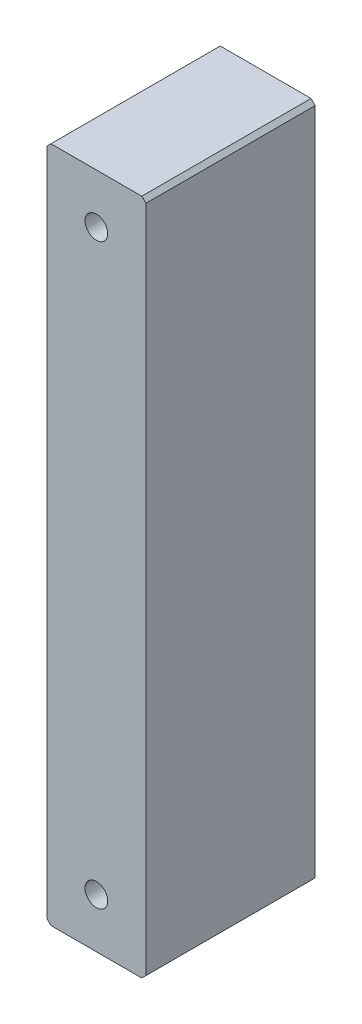
ISO-10303-21;
HEADER;
FILE_DESCRIPTION(('STEP AP214'),'2;1');
FILE_NAME('part.step','',(''),(''),'','','');
FILE_SCHEMA(('AUTOMOTIVE_DESIGN { 1 0 10303 214 1 1 1 1 }'));
ENDSEC;
DATA;
#1=APPLICATION_CONTEXT('core data for automotive mechanical design processes');
#2=APPLICATION_PROTOCOL_DEFINITION('international standard','automotive_design',2000,#1);
#3=PRODUCT_CONTEXT('',#1,'mechanical');
#4=PRODUCT('Part','Part','',(#3));
#5=PRODUCT_RELATED_PRODUCT_CATEGORY('part','',(#4));
#6=PRODUCT_DEFINITION_FORMATION('','',#4);
#7=PRODUCT_DEFINITION_CONTEXT('part definition',#1,'design');
#8=PRODUCT_DEFINITION('design','',#6,#7);
#9=PRODUCT_DEFINITION_SHAPE('','',#8);
#10=(LENGTH_UNIT() NAMED_UNIT(*) SI_UNIT(.MILLI.,.METRE.));
#11=(NAMED_UNIT(*) PLANE_ANGLE_UNIT() SI_UNIT($,.RADIAN.));
#12=(NAMED_UNIT(*) SI_UNIT($,.STERADIAN.) SOLID_ANGLE_UNIT());
#13=UNCERTAINTY_MEASURE_WITH_UNIT(LENGTH_MEASURE(1.E-05),#10,'distance_accuracy_value','');
#14=(GEOMETRIC_REPRESENTATION_CONTEXT(3) GLOBAL_UNCERTAINTY_ASSIGNED_CONTEXT((#13)) GLOBAL_UNIT_ASSIGNED_CONTEXT((#10,
#11,#12)) REPRESENTATION_CONTEXT('',''));
#15=CARTESIAN_POINT('',(0.,0.,0.));
#16=DIRECTION('',(0.,0.,1.));
#17=DIRECTION('',(1.,0.,0.));
#18=AXIS2_PLACEMENT_3D('',#15,#16,#17);
#19=CARTESIAN_POINT('',(0.,0.,41.));
#20=DIRECTION('',(0.,0.,1.));
#21=DIRECTION('',(1.,0.,0.));
#22=AXIS2_PLACEMENT_3D('',#19,#20,#21);
#23=PLANE('',#22);
#24=CARTESIAN_POINT('',(-580.282716972666,975.41894440651,41.));
#25=DIRECTION('',(0.,0.,1.));
#26=DIRECTION('',(1.,0.,0.));
#27=AXIS2_PLACEMENT_3D('',#24,#25,#26);
#28=CIRCLE('',#27,2.75000000000005);
#29=CARTESIAN_POINT('',(-577.532716972666,975.41894440651,41.));
#30=VERTEX_POINT('',#29);
#31=EDGE_CURVE('E139',#30,#30,#28,.T.);
#32=ORIENTED_EDGE('',*,*,#31,.F.);
#33=EDGE_LOOP('',(#32));
#34=FACE_BOUND('',#33,.T.);
#35=DIRECTION('',(-1.,0.,0.));
#36=VECTOR('',#35,1.);
#37=CARTESIAN_POINT('',(-591.282716972666,987.41894440651,41.));
#38=LINE('',#37,#36);
#39=CARTESIAN_POINT('',(-569.282716972666,987.41894440651,41.));
#40=VERTEX_POINT('',#39);
#41=CARTESIAN_POINT('',(-591.282716972666,987.41894440651,41.));
#42=VERTEX_POINT('',#41);
#43=EDGE_CURVE('E152',#40,#42,#38,.T.);
#44=ORIENTED_EDGE('',*,*,#43,.T.);
#45=DIRECTION('',(-0.707106781186547,-0.707106781186547,0.));
#46=VECTOR('',#45,1.);
#47=CARTESIAN_POINT('',(-592.282716972666,986.41894440651,41.));
#48=LINE('',#47,#46);
#49=CARTESIAN_POINT('',(-592.282716972666,986.41894440651,41.));
#50=VERTEX_POINT('',#49);
#51=EDGE_CURVE('E98',#42,#50,#48,.T.);
#52=ORIENTED_EDGE('',*,*,#51,.T.);
#53=DIRECTION('',(0.,-1.,0.));
#54=VECTOR('',#53,1.);
#55=CARTESIAN_POINT('',(-592.282716972666,824.41894440651,41.));
#56=LINE('',#55,#54);
#57=CARTESIAN_POINT('',(-592.282716972666,824.41894440651,41.));
#58=VERTEX_POINT('',#57);
#59=EDGE_CURVE('E168',#50,#58,#56,.T.);
#60=ORIENTED_EDGE('',*,*,#59,.T.);
#61=DIRECTION('',(0.707106781186547,-0.707106781186547,0.));
#62=VECTOR('',#61,1.);
#63=CARTESIAN_POINT('',(-591.282716972666,823.41894440651,41.));
#64=LINE('',#63,#62);
#65=CARTESIAN_POINT('',(-591.282716972666,823.41894440651,41.));
#66=VERTEX_POINT('',#65);
#67=EDGE_CURVE('E177',#58,#66,#64,.T.);
#68=ORIENTED_EDGE('',*,*,#67,.T.);
#69=DIRECTION('',(1.,0.,0.));
#70=VECTOR('',#69,1.);
#71=CARTESIAN_POINT('',(-591.282716972666,823.41894440651,41.));
#72=LINE('',#71,#70);
#73=CARTESIAN_POINT('',(-569.282716972666,823.41894440651,41.));
#74=VERTEX_POINT('',#73);
#75=EDGE_CURVE('E120',#66,#74,#72,.T.);
#76=ORIENTED_EDGE('',*,*,#75,.T.);
#77=DIRECTION('',(0.707106781186547,0.707106781186547,0.));
#78=VECTOR('',#77,1.);
#79=CARTESIAN_POINT('',(-569.282716972666,823.41894440651,41.));
#80=LINE('',#79,#78);
#81=CARTESIAN_POINT('',(-568.282716972666,824.41894440651,41.));
#82=VERTEX_POINT('',#81);
#83=EDGE_CURVE('E115',#74,#82,#80,.T.);
#84=ORIENTED_EDGE('',*,*,#83,.T.);
#85=DIRECTION('',(0.,1.,0.));
#86=VECTOR('',#85,1.);
#87=CARTESIAN_POINT('',(-568.282716972666,824.41894440651,41.));
#88=LINE('',#87,#86);
#89=CARTESIAN_POINT('',(-568.282716972666,986.41894440651,41.));
#90=VERTEX_POINT('',#89);
#91=EDGE_CURVE('E117',#82,#90,#88,.T.);
#92=ORIENTED_EDGE('',*,*,#91,.T.);
#93=DIRECTION('',(-0.707106781186547,0.707106781186547,0.));
#94=VECTOR('',#93,1.);
#95=CARTESIAN_POINT('',(-569.282716972666,987.41894440651,41.));
#96=LINE('',#95,#94);
#97=EDGE_CURVE('E57',#90,#40,#96,.T.);
#98=ORIENTED_EDGE('',*,*,#97,.T.);
#99=EDGE_LOOP('',(#44,#52,#60,#68,#76,#84,#92,#98));
#100=FACE_BOUND('',#99,.T.);
#101=CARTESIAN_POINT('',(-580.282716972666,835.41894440651,41.));
#102=DIRECTION('',(0.,0.,1.));
#103=DIRECTION('',(1.,0.,0.));
#104=AXIS2_PLACEMENT_3D('',#101,#102,#103);
#105=CIRCLE('',#104,2.75000000000005);
#106=CARTESIAN_POINT('',(-577.532716972666,835.41894440651,41.));
#107=VERTEX_POINT('',#106);
#108=EDGE_CURVE('E187',#107,#107,#105,.T.);
#109=ORIENTED_EDGE('',*,*,#108,.F.);
#110=EDGE_LOOP('',(#109));
#111=FACE_BOUND('',#110,.T.);
#112=ADVANCED_FACE('F39',(#34,#100,#111),#23,.T.);
#113=CARTESIAN_POINT('',(0.,0.,0.));
#114=DIRECTION('',(0.,0.,1.));
#115=DIRECTION('',(1.,0.,0.));
#116=AXIS2_PLACEMENT_3D('',#113,#114,#115);
#117=PLANE('',#116);
#118=DIRECTION('',(-1.,0.,0.));
#119=VECTOR('',#118,1.);
#120=CARTESIAN_POINT('',(-591.282716972666,987.41894440651,0.));
#121=LINE('',#120,#119);
#122=CARTESIAN_POINT('',(-569.282716972666,987.41894440651,0.));
#123=VERTEX_POINT('',#122);
#124=CARTESIAN_POINT('',(-591.282716972666,987.41894440651,0.));
#125=VERTEX_POINT('',#124);
#126=EDGE_CURVE('E136',#123,#125,#121,.T.);
#127=ORIENTED_EDGE('',*,*,#126,.F.);
#128=DIRECTION('',(-0.707106781186547,0.707106781186547,0.));
#129=VECTOR('',#128,1.);
#130=CARTESIAN_POINT('',(-569.282716972666,987.41894440651,0.));
#131=LINE('',#130,#129);
#132=CARTESIAN_POINT('',(-568.282716972666,986.41894440651,0.));
#133=VERTEX_POINT('',#132);
#134=EDGE_CURVE('E91',#133,#123,#131,.T.);
#135=ORIENTED_EDGE('',*,*,#134,.F.);
#136=DIRECTION('',(0.,1.,0.));
#137=VECTOR('',#136,1.);
#138=CARTESIAN_POINT('',(-568.282716972666,824.41894440651,0.));
#139=LINE('',#138,#137);
#140=CARTESIAN_POINT('',(-568.282716972666,824.41894440651,0.));
#141=VERTEX_POINT('',#140);
#142=EDGE_CURVE('E82',#141,#133,#139,.T.);
#143=ORIENTED_EDGE('',*,*,#142,.F.);
#144=DIRECTION('',(0.707106781186547,0.707106781186547,0.));
#145=VECTOR('',#144,1.);
#146=CARTESIAN_POINT('',(-569.282716972666,823.41894440651,0.));
#147=LINE('',#146,#145);
#148=CARTESIAN_POINT('',(-569.282716972666,823.41894440651,0.));
#149=VERTEX_POINT('',#148);
#150=EDGE_CURVE('E128',#149,#141,#147,.T.);
#151=ORIENTED_EDGE('',*,*,#150,.F.);
#152=DIRECTION('',(1.,0.,0.));
#153=VECTOR('',#152,1.);
#154=CARTESIAN_POINT('',(-591.282716972666,823.41894440651,0.));
#155=LINE('',#154,#153);
#156=CARTESIAN_POINT('',(-591.282716972666,823.41894440651,0.));
#157=VERTEX_POINT('',#156);
#158=EDGE_CURVE('E147',#157,#149,#155,.T.);
#159=ORIENTED_EDGE('',*,*,#158,.F.);
#160=DIRECTION('',(0.707106781186547,-0.707106781186547,0.));
#161=VECTOR('',#160,1.);
#162=CARTESIAN_POINT('',(-591.282716972666,823.41894440651,0.));
#163=LINE('',#162,#161);
#164=CARTESIAN_POINT('',(-592.282716972666,824.41894440651,0.));
#165=VERTEX_POINT('',#164);
#166=EDGE_CURVE('E143',#165,#157,#163,.T.);
#167=ORIENTED_EDGE('',*,*,#166,.F.);
#168=DIRECTION('',(0.,-1.,0.));
#169=VECTOR('',#168,1.);
#170=CARTESIAN_POINT('',(-592.282716972666,824.41894440651,0.));
#171=LINE('',#170,#169);
#172=CARTESIAN_POINT('',(-592.282716972666,986.41894440651,0.));
#173=VERTEX_POINT('',#172);
#174=EDGE_CURVE('E145',#173,#165,#171,.T.);
#175=ORIENTED_EDGE('',*,*,#174,.F.);
#176=DIRECTION('',(-0.707106781186547,-0.707106781186547,0.));
#177=VECTOR('',#176,1.);
#178=CARTESIAN_POINT('',(-592.282716972666,986.41894440651,0.));
#179=LINE('',#178,#177);
#180=EDGE_CURVE('E137',#125,#173,#179,.T.);
#181=ORIENTED_EDGE('',*,*,#180,.F.);
#182=EDGE_LOOP('',(#127,#135,#143,#151,#159,#167,#175,#181));
#183=FACE_BOUND('',#182,.T.);
#184=CARTESIAN_POINT('',(-580.282716972666,975.41894440651,0.));
#185=DIRECTION('',(0.,0.,1.));
#186=DIRECTION('',(1.,0.,0.));
#187=AXIS2_PLACEMENT_3D('',#184,#185,#186);
#188=CIRCLE('',#187,2.75000000000005);
#189=CARTESIAN_POINT('',(-577.532716972666,975.41894440651,0.));
#190=VERTEX_POINT('',#189);
#191=EDGE_CURVE('E184',#190,#190,#188,.T.);
#192=ORIENTED_EDGE('',*,*,#191,.T.);
#193=EDGE_LOOP('',(#192));
#194=FACE_BOUND('',#193,.T.);
#195=CARTESIAN_POINT('',(-580.282716972666,835.41894440651,0.));
#196=DIRECTION('',(0.,0.,1.));
#197=DIRECTION('',(1.,0.,0.));
#198=AXIS2_PLACEMENT_3D('',#195,#196,#197);
#199=CIRCLE('',#198,2.75000000000005);
#200=CARTESIAN_POINT('',(-577.532716972666,835.41894440651,0.));
#201=VERTEX_POINT('',#200);
#202=EDGE_CURVE('E192',#201,#201,#199,.T.);
#203=ORIENTED_EDGE('',*,*,#202,.T.);
#204=EDGE_LOOP('',(#203));
#205=FACE_BOUND('',#204,.T.);
#206=ADVANCED_FACE('F169',(#183,#194,#205),#117,.F.);
#207=CARTESIAN_POINT('',(-591.282716972666,987.41894440651,41.));
#208=DIRECTION('',(0.,-1.,0.));
#209=DIRECTION('',(0.,0.,-1.));
#210=AXIS2_PLACEMENT_3D('',#207,#208,#209);
#211=PLANE('',#210);
#212=ORIENTED_EDGE('',*,*,#126,.T.);
#213=DIRECTION('',(0.,0.,-1.));
#214=VECTOR('',#213,1.);
#215=CARTESIAN_POINT('',(-591.282716972666,987.41894440651,41.));
#216=LINE('',#215,#214);
#217=EDGE_CURVE('E11',#42,#125,#216,.T.);
#218=ORIENTED_EDGE('',*,*,#217,.F.);
#219=ORIENTED_EDGE('',*,*,#43,.F.);
#220=DIRECTION('',(0.,0.,-1.));
#221=VECTOR('',#220,1.);
#222=CARTESIAN_POINT('',(-569.282716972666,987.41894440651,41.));
#223=LINE('',#222,#221);
#224=EDGE_CURVE('E135',#40,#123,#223,.T.);
#225=ORIENTED_EDGE('',*,*,#224,.T.);
#226=EDGE_LOOP('',(#212,#218,#219,#225));
#227=FACE_BOUND('',#226,.T.);
#228=ADVANCED_FACE('F41',(#227),#211,.F.);
#229=CARTESIAN_POINT('',(-592.282716972666,986.41894440651,41.));
#230=DIRECTION('',(0.707106781186548,-0.707106781186548,0.));
#231=DIRECTION('',(0.707106781186548,0.707106781186548,0.));
#232=AXIS2_PLACEMENT_3D('',#229,#230,#231);
#233=PLANE('',#232);
#234=ORIENTED_EDGE('',*,*,#180,.T.);
#235=DIRECTION('',(0.,0.,-1.));
#236=VECTOR('',#235,1.);
#237=CARTESIAN_POINT('',(-592.282716972666,986.41894440651,41.));
#238=LINE('',#237,#236);
#239=EDGE_CURVE('E48',#50,#173,#238,.T.);
#240=ORIENTED_EDGE('',*,*,#239,.F.);
#241=ORIENTED_EDGE('',*,*,#51,.F.);
#242=ORIENTED_EDGE('',*,*,#217,.T.);
#243=EDGE_LOOP('',(#234,#240,#241,#242));
#244=FACE_BOUND('',#243,.T.);
#245=ADVANCED_FACE('F223',(#244),#233,.F.);
#246=CARTESIAN_POINT('',(-592.282716972666,824.41894440651,41.));
#247=DIRECTION('',(1.,0.,0.));
#248=DIRECTION('',(0.,0.,-1.));
#249=AXIS2_PLACEMENT_3D('',#246,#247,#248);
#250=PLANE('',#249);
#251=ORIENTED_EDGE('',*,*,#174,.T.);
#252=DIRECTION('',(0.,0.,-1.));
#253=VECTOR('',#252,1.);
#254=CARTESIAN_POINT('',(-592.282716972666,824.41894440651,41.));
#255=LINE('',#254,#253);
#256=EDGE_CURVE('E156',#58,#165,#255,.T.);
#257=ORIENTED_EDGE('',*,*,#256,.F.);
#258=ORIENTED_EDGE('',*,*,#59,.F.);
#259=ORIENTED_EDGE('',*,*,#239,.T.);
#260=EDGE_LOOP('',(#251,#257,#258,#259));
#261=FACE_BOUND('',#260,.T.);
#262=ADVANCED_FACE('F161',(#261),#250,.F.);
#263=CARTESIAN_POINT('',(-591.282716972666,823.41894440651,41.));
#264=DIRECTION('',(0.707106781186548,0.707106781186548,0.));
#265=DIRECTION('',(-0.707106781186548,0.707106781186548,0.));
#266=AXIS2_PLACEMENT_3D('',#263,#264,#265);
#267=PLANE('',#266);
#268=ORIENTED_EDGE('',*,*,#166,.T.);
#269=DIRECTION('',(0.,0.,-1.));
#270=VECTOR('',#269,1.);
#271=CARTESIAN_POINT('',(-591.282716972666,823.41894440651,41.));
#272=LINE('',#271,#270);
#273=EDGE_CURVE('E153',#66,#157,#272,.T.);
#274=ORIENTED_EDGE('',*,*,#273,.F.);
#275=ORIENTED_EDGE('',*,*,#67,.F.);
#276=ORIENTED_EDGE('',*,*,#256,.T.);
#277=EDGE_LOOP('',(#268,#274,#275,#276));
#278=FACE_BOUND('',#277,.T.);
#279=ADVANCED_FACE('F172',(#278),#267,.F.);
#280=CARTESIAN_POINT('',(-591.282716972666,823.41894440651,41.));
#281=DIRECTION('',(0.,1.,0.));
#282=DIRECTION('',(0.,0.,1.));
#283=AXIS2_PLACEMENT_3D('',#280,#281,#282);
#284=PLANE('',#283);
#285=ORIENTED_EDGE('',*,*,#158,.T.);
#286=DIRECTION('',(0.,0.,-1.));
#287=VECTOR('',#286,1.);
#288=CARTESIAN_POINT('',(-569.282716972666,823.41894440651,41.));
#289=LINE('',#288,#287);
#290=EDGE_CURVE('E130',#74,#149,#289,.T.);
#291=ORIENTED_EDGE('',*,*,#290,.F.);
#292=ORIENTED_EDGE('',*,*,#75,.F.);
#293=ORIENTED_EDGE('',*,*,#273,.T.);
#294=EDGE_LOOP('',(#285,#291,#292,#293));
#295=FACE_BOUND('',#294,.T.);
#296=ADVANCED_FACE('F178',(#295),#284,.F.);
#297=CARTESIAN_POINT('',(-569.282716972666,823.41894440651,41.));
#298=DIRECTION('',(-0.707106781186548,0.707106781186548,0.));
#299=DIRECTION('',(-0.707106781186548,-0.707106781186548,0.));
#300=AXIS2_PLACEMENT_3D('',#297,#298,#299);
#301=PLANE('',#300);
#302=ORIENTED_EDGE('',*,*,#150,.T.);
#303=DIRECTION('',(0.,0.,-1.));
#304=VECTOR('',#303,1.);
#305=CARTESIAN_POINT('',(-568.282716972666,824.41894440651,41.));
#306=LINE('',#305,#304);
#307=EDGE_CURVE('E121',#82,#141,#306,.T.);
#308=ORIENTED_EDGE('',*,*,#307,.F.);
#309=ORIENTED_EDGE('',*,*,#83,.F.);
#310=ORIENTED_EDGE('',*,*,#290,.T.);
#311=EDGE_LOOP('',(#302,#308,#309,#310));
#312=FACE_BOUND('',#311,.T.);
#313=ADVANCED_FACE('F125',(#312),#301,.F.);
#314=CARTESIAN_POINT('',(-568.282716972666,824.41894440651,41.));
#315=DIRECTION('',(-1.,0.,0.));
#316=DIRECTION('',(0.,0.,1.));
#317=AXIS2_PLACEMENT_3D('',#314,#315,#316);
#318=PLANE('',#317);
#319=ORIENTED_EDGE('',*,*,#142,.T.);
#320=DIRECTION('',(0.,0.,-1.));
#321=VECTOR('',#320,1.);
#322=CARTESIAN_POINT('',(-568.282716972666,986.41894440651,41.));
#323=LINE('',#322,#321);
#324=EDGE_CURVE('E126',#90,#133,#323,.T.);
#325=ORIENTED_EDGE('',*,*,#324,.F.);
#326=ORIENTED_EDGE('',*,*,#91,.F.);
#327=ORIENTED_EDGE('',*,*,#307,.T.);
#328=EDGE_LOOP('',(#319,#325,#326,#327));
#329=FACE_BOUND('',#328,.T.);
#330=ADVANCED_FACE('F127',(#329),#318,.F.);
#331=CARTESIAN_POINT('',(-569.282716972666,987.41894440651,41.));
#332=DIRECTION('',(-0.707106781186548,-0.707106781186548,0.));
#333=DIRECTION('',(0.707106781186548,-0.707106781186548,0.));
#334=AXIS2_PLACEMENT_3D('',#331,#332,#333);
#335=PLANE('',#334);
#336=ORIENTED_EDGE('',*,*,#134,.T.);
#337=ORIENTED_EDGE('',*,*,#224,.F.);
#338=ORIENTED_EDGE('',*,*,#97,.F.);
#339=ORIENTED_EDGE('',*,*,#324,.T.);
#340=EDGE_LOOP('',(#336,#337,#338,#339));
#341=FACE_BOUND('',#340,.T.);
#342=ADVANCED_FACE('F213',(#341),#335,.F.);
#343=CARTESIAN_POINT('',(-580.282716972666,975.41894440651,41.));
#344=DIRECTION('',(0.,0.,-1.));
#345=DIRECTION('',(-1.,0.,0.));
#346=AXIS2_PLACEMENT_3D('',#343,#344,#345);
#347=CYLINDRICAL_SURFACE('',#346,2.75000000000005);
#348=ORIENTED_EDGE('',*,*,#31,.T.);
#349=EDGE_LOOP('',(#348));
#350=FACE_BOUND('',#349,.T.);
#351=ORIENTED_EDGE('',*,*,#191,.F.);
#352=EDGE_LOOP('',(#351));
#353=FACE_BOUND('',#352,.T.);
#354=ADVANCED_FACE('F210',(#350,#353),#347,.F.);
#355=CARTESIAN_POINT('',(-580.282716972666,835.41894440651,41.));
#356=DIRECTION('',(0.,0.,-1.));
#357=DIRECTION('',(-1.,0.,0.));
#358=AXIS2_PLACEMENT_3D('',#355,#356,#357);
#359=CYLINDRICAL_SURFACE('',#358,2.75000000000005);
#360=ORIENTED_EDGE('',*,*,#108,.T.);
#361=EDGE_LOOP('',(#360));
#362=FACE_BOUND('',#361,.T.);
#363=ORIENTED_EDGE('',*,*,#202,.F.);
#364=EDGE_LOOP('',(#363));
#365=FACE_BOUND('',#364,.T.);
#366=ADVANCED_FACE('F199',(#362,#365),#359,.F.);
#367=CLOSED_SHELL('',(#112,#206,#228,#245,#262,#279,#296,#313,#330,#342,#354,#366));
#368=MANIFOLD_SOLID_BREP('B2',#367);
#369=ADVANCED_BREP_SHAPE_REPRESENTATION('',(#18,#368),#14);
#370=SHAPE_DEFINITION_REPRESENTATION(#9,#369);
ENDSEC;
END-ISO-10303-21;
